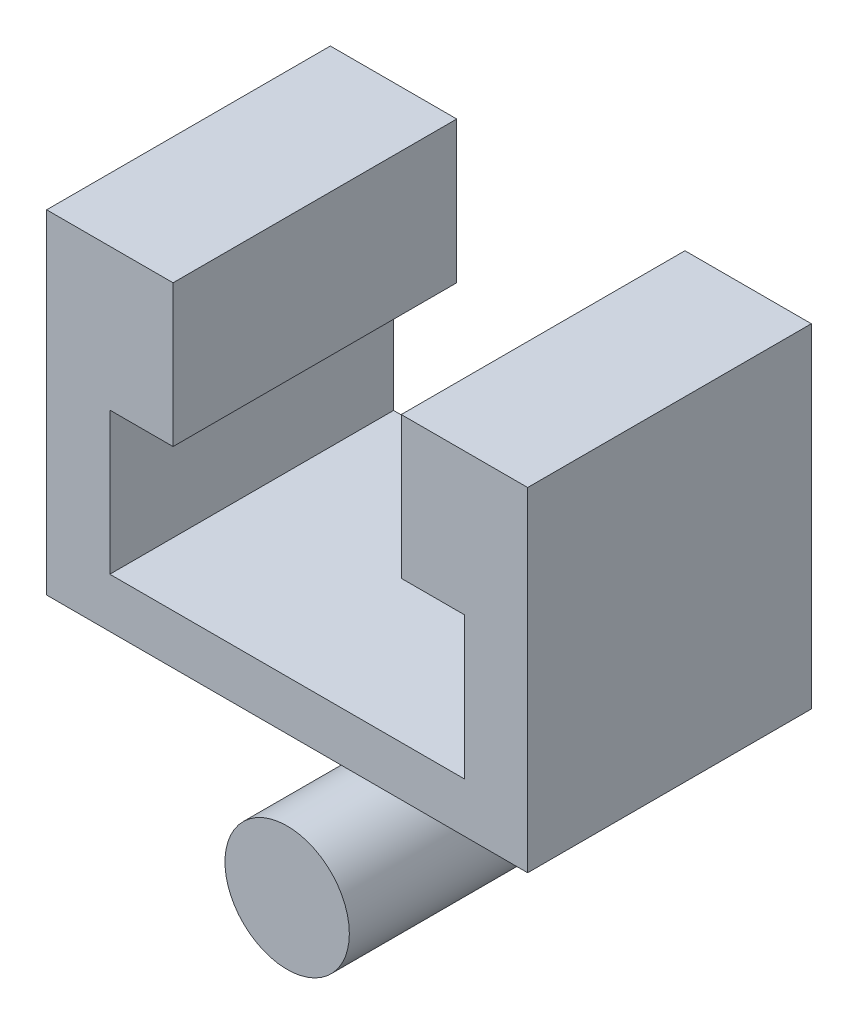
ISO-10303-21;
HEADER;
FILE_DESCRIPTION(('STEP AP214'),'2;1');
FILE_NAME('part.step','',(''),(''),'','','');
FILE_SCHEMA(('AUTOMOTIVE_DESIGN { 1 0 10303 214 1 1 1 1 }'));
ENDSEC;
DATA;
#1=APPLICATION_CONTEXT('core data for automotive mechanical design processes');
#2=APPLICATION_PROTOCOL_DEFINITION('international standard','automotive_design',2000,#1);
#3=PRODUCT_CONTEXT('',#1,'mechanical');
#4=PRODUCT('Part','Part','',(#3));
#5=PRODUCT_RELATED_PRODUCT_CATEGORY('part','',(#4));
#6=PRODUCT_DEFINITION_FORMATION('','',#4);
#7=PRODUCT_DEFINITION_CONTEXT('part definition',#1,'design');
#8=PRODUCT_DEFINITION('design','',#6,#7);
#9=PRODUCT_DEFINITION_SHAPE('','',#8);
#10=(LENGTH_UNIT() NAMED_UNIT(*) SI_UNIT(.MILLI.,.METRE.));
#11=(NAMED_UNIT(*) PLANE_ANGLE_UNIT() SI_UNIT($,.RADIAN.));
#12=(NAMED_UNIT(*) SI_UNIT($,.STERADIAN.) SOLID_ANGLE_UNIT());
#13=UNCERTAINTY_MEASURE_WITH_UNIT(LENGTH_MEASURE(1.E-05),#10,'distance_accuracy_value','');
#14=(GEOMETRIC_REPRESENTATION_CONTEXT(3) GLOBAL_UNCERTAINTY_ASSIGNED_CONTEXT((#13)) GLOBAL_UNIT_ASSIGNED_CONTEXT((#10,
#11,#12)) REPRESENTATION_CONTEXT('',''));
#15=CARTESIAN_POINT('',(0.,0.,0.));
#16=DIRECTION('',(0.,0.,1.));
#17=DIRECTION('',(1.,0.,0.));
#18=AXIS2_PLACEMENT_3D('',#15,#16,#17);
#19=CARTESIAN_POINT('',(0.,0.,0.));
#20=DIRECTION('',(0.,0.,1.));
#21=DIRECTION('',(1.,0.,0.));
#22=AXIS2_PLACEMENT_3D('',#19,#20,#21);
#23=PLANE('',#22);
#24=DIRECTION('',(0.,1.,0.));
#25=VECTOR('',#24,1.);
#26=CARTESIAN_POINT('',(-20.4314842766278,59.7480723545712,0.));
#27=LINE('',#26,#25);
#28=CARTESIAN_POINT('',(-20.4314842766278,59.7480723545712,0.));
#29=VERTEX_POINT('',#28);
#30=CARTESIAN_POINT('',(-20.4314842766277,85.1480723545712,0.));
#31=VERTEX_POINT('',#30);
#32=EDGE_CURVE('E217',#29,#31,#27,.T.);
#33=ORIENTED_EDGE('',*,*,#32,.F.);
#34=DIRECTION('',(1.,0.,0.));
#35=VECTOR('',#34,1.);
#36=CARTESIAN_POINT('',(-31.75,59.7480723545712,0.));
#37=LINE('',#36,#35);
#38=CARTESIAN_POINT('',(-31.75,59.7480723545712,0.));
#39=VERTEX_POINT('',#38);
#40=EDGE_CURVE('E230',#39,#29,#37,.T.);
#41=ORIENTED_EDGE('',*,*,#40,.F.);
#42=DIRECTION('',(0.,1.,0.));
#43=VECTOR('',#42,1.);
#44=CARTESIAN_POINT('',(-31.75,34.29,0.));
#45=LINE('',#44,#43);
#46=CARTESIAN_POINT('',(-31.75,34.29,0.));
#47=VERTEX_POINT('',#46);
#48=EDGE_CURVE('E228',#47,#39,#45,.T.);
#49=ORIENTED_EDGE('',*,*,#48,.F.);
#50=DIRECTION('',(-1.,0.,0.));
#51=VECTOR('',#50,1.);
#52=CARTESIAN_POINT('',(31.75,34.29,0.));
#53=LINE('',#52,#51);
#54=CARTESIAN_POINT('',(31.75,34.29,0.));
#55=VERTEX_POINT('',#54);
#56=EDGE_CURVE('E226',#55,#47,#53,.T.);
#57=ORIENTED_EDGE('',*,*,#56,.F.);
#58=DIRECTION('',(0.,-1.,0.));
#59=VECTOR('',#58,1.);
#60=CARTESIAN_POINT('',(31.75,59.7480723545712,0.));
#61=LINE('',#60,#59);
#62=CARTESIAN_POINT('',(31.75,59.7480723545712,0.));
#63=VERTEX_POINT('',#62);
#64=EDGE_CURVE('E224',#63,#55,#61,.T.);
#65=ORIENTED_EDGE('',*,*,#64,.F.);
#66=DIRECTION('',(1.,0.,0.));
#67=VECTOR('',#66,1.);
#68=CARTESIAN_POINT('',(20.4314842766277,59.7480723545712,0.));
#69=LINE('',#68,#67);
#70=CARTESIAN_POINT('',(20.4314842766277,59.7480723545712,0.));
#71=VERTEX_POINT('',#70);
#72=EDGE_CURVE('E222',#71,#63,#69,.T.);
#73=ORIENTED_EDGE('',*,*,#72,.F.);
#74=DIRECTION('',(0.,-1.,0.));
#75=VECTOR('',#74,1.);
#76=CARTESIAN_POINT('',(20.4314842766278,85.1480723545712,0.));
#77=LINE('',#76,#75);
#78=CARTESIAN_POINT('',(20.4314842766278,85.1480723545712,0.));
#79=VERTEX_POINT('',#78);
#80=EDGE_CURVE('E219',#79,#71,#77,.T.);
#81=ORIENTED_EDGE('',*,*,#80,.F.);
#82=DIRECTION('',(-1.,0.,0.));
#83=VECTOR('',#82,1.);
#84=CARTESIAN_POINT('',(43.0685157233723,85.1480723545712,0.));
#85=LINE('',#84,#83);
#86=CARTESIAN_POINT('',(43.0685157233723,85.1480723545712,0.));
#87=VERTEX_POINT('',#86);
#88=EDGE_CURVE('E274',#87,#79,#85,.T.);
#89=ORIENTED_EDGE('',*,*,#88,.F.);
#90=DIRECTION('',(0.,1.,0.));
#91=VECTOR('',#90,1.);
#92=CARTESIAN_POINT('',(43.0685157233722,25.4,0.));
#93=LINE('',#92,#91);
#94=CARTESIAN_POINT('',(43.0685157233722,25.4,0.));
#95=VERTEX_POINT('',#94);
#96=EDGE_CURVE('E289',#95,#87,#93,.T.);
#97=ORIENTED_EDGE('',*,*,#96,.F.);
#98=DIRECTION('',(1.,0.,0.));
#99=VECTOR('',#98,1.);
#100=CARTESIAN_POINT('',(-43.0685157233722,25.4,0.));
#101=LINE('',#100,#99);
#102=CARTESIAN_POINT('',(11.1361185564172,25.4,0.));
#103=VERTEX_POINT('',#102);
#104=EDGE_CURVE('E285',#103,#95,#101,.T.);
#105=ORIENTED_EDGE('',*,*,#104,.F.);
#106=DIRECTION('',(0.,-1.,0.));
#107=VECTOR('',#106,1.);
#108=CARTESIAN_POINT('',(11.1361185564172,25.4,0.));
#109=LINE('',#108,#107);
#110=CARTESIAN_POINT('',(11.1361185564172,0.,0.));
#111=VERTEX_POINT('',#110);
#112=EDGE_CURVE('E309',#103,#111,#109,.T.);
#113=ORIENTED_EDGE('',*,*,#112,.T.);
#114=CARTESIAN_POINT('',(0.,0.,0.));
#115=DIRECTION('',(0.,0.,1.));
#116=DIRECTION('',(1.,0.,0.));
#117=AXIS2_PLACEMENT_3D('',#114,#115,#116);
#118=CIRCLE('',#117,11.1361185564172);
#119=CARTESIAN_POINT('',(-11.1361185564172,0.,0.));
#120=VERTEX_POINT('',#119);
#121=EDGE_CURVE('E305',#120,#111,#118,.T.);
#122=ORIENTED_EDGE('',*,*,#121,.F.);
#123=DIRECTION('',(0.,1.,0.));
#124=VECTOR('',#123,1.);
#125=CARTESIAN_POINT('',(-11.1361185564172,0.,0.));
#126=LINE('',#125,#124);
#127=CARTESIAN_POINT('',(-11.1361185564172,25.4,0.));
#128=VERTEX_POINT('',#127);
#129=EDGE_CURVE('E315',#120,#128,#126,.T.);
#130=ORIENTED_EDGE('',*,*,#129,.T.);
#131=CARTESIAN_POINT('',(-43.0685157233722,25.4,0.));
#132=VERTEX_POINT('',#131);
#133=EDGE_CURVE('E286',#132,#128,#101,.T.);
#134=ORIENTED_EDGE('',*,*,#133,.F.);
#135=DIRECTION('',(0.,-1.,0.));
#136=VECTOR('',#135,1.);
#137=CARTESIAN_POINT('',(-43.0685157233723,85.1480723545712,0.));
#138=LINE('',#137,#136);
#139=CARTESIAN_POINT('',(-43.0685157233723,85.1480723545712,0.));
#140=VERTEX_POINT('',#139);
#141=EDGE_CURVE('E269',#140,#132,#138,.T.);
#142=ORIENTED_EDGE('',*,*,#141,.F.);
#143=EDGE_CURVE('E291',#31,#140,#85,.T.);
#144=ORIENTED_EDGE('',*,*,#143,.F.);
#145=EDGE_LOOP('',(#33,#41,#49,#57,#65,#73,#81,#89,#97,#105,#113,#122,#130,#134,#142,#144));
#146=FACE_BOUND('',#145,.T.);
#147=ADVANCED_FACE('F45',(#146),#23,.F.);
#148=CARTESIAN_POINT('',(43.0685157233723,85.1480723545712,50.8));
#149=DIRECTION('',(0.,-1.,0.));
#150=DIRECTION('',(0.,0.,-1.));
#151=AXIS2_PLACEMENT_3D('',#148,#149,#150);
#152=PLANE('',#151);
#153=DIRECTION('',(0.,0.,1.));
#154=VECTOR('',#153,1.);
#155=CARTESIAN_POINT('',(-20.4314842766277,85.1480723545712,0.));
#156=LINE('',#155,#154);
#157=CARTESIAN_POINT('',(-20.4314842766277,85.1480723545712,50.8));
#158=VERTEX_POINT('',#157);
#159=EDGE_CURVE('E267',#31,#158,#156,.T.);
#160=ORIENTED_EDGE('',*,*,#159,.F.);
#161=ORIENTED_EDGE('',*,*,#143,.T.);
#162=DIRECTION('',(0.,0.,-1.));
#163=VECTOR('',#162,1.);
#164=CARTESIAN_POINT('',(-43.0685157233723,85.1480723545712,50.8));
#165=LINE('',#164,#163);
#166=CARTESIAN_POINT('',(-43.0685157233723,85.1480723545712,50.8));
#167=VERTEX_POINT('',#166);
#168=EDGE_CURVE('E282',#167,#140,#165,.T.);
#169=ORIENTED_EDGE('',*,*,#168,.F.);
#170=DIRECTION('',(-1.,0.,0.));
#171=VECTOR('',#170,1.);
#172=CARTESIAN_POINT('',(43.0685157233723,85.1480723545712,50.8));
#173=LINE('',#172,#171);
#174=EDGE_CURVE('E278',#158,#167,#173,.T.);
#175=ORIENTED_EDGE('',*,*,#174,.F.);
#176=EDGE_LOOP('',(#160,#161,#169,#175));
#177=FACE_BOUND('',#176,.T.);
#178=ADVANCED_FACE('F377',(#177),#152,.F.);
#179=DIRECTION('',(0.,0.,1.));
#180=VECTOR('',#179,1.);
#181=CARTESIAN_POINT('',(20.4314842766278,85.1480723545712,0.));
#182=LINE('',#181,#180);
#183=CARTESIAN_POINT('',(20.4314842766278,85.1480723545712,50.8));
#184=VERTEX_POINT('',#183);
#185=EDGE_CURVE('E264',#79,#184,#182,.T.);
#186=ORIENTED_EDGE('',*,*,#185,.T.);
#187=CARTESIAN_POINT('',(43.0685157233723,85.1480723545712,50.8));
#188=VERTEX_POINT('',#187);
#189=EDGE_CURVE('E279',#188,#184,#173,.T.);
#190=ORIENTED_EDGE('',*,*,#189,.F.);
#191=DIRECTION('',(0.,0.,-1.));
#192=VECTOR('',#191,1.);
#193=CARTESIAN_POINT('',(43.0685157233723,85.1480723545712,50.8));
#194=LINE('',#193,#192);
#195=EDGE_CURVE('E296',#188,#87,#194,.T.);
#196=ORIENTED_EDGE('',*,*,#195,.T.);
#197=ORIENTED_EDGE('',*,*,#88,.T.);
#198=EDGE_LOOP('',(#186,#190,#196,#197));
#199=FACE_BOUND('',#198,.T.);
#200=ADVANCED_FACE('F383',(#199),#152,.F.);
#201=CARTESIAN_POINT('',(0.,0.,50.8));
#202=DIRECTION('',(0.,0.,1.));
#203=DIRECTION('',(1.,0.,0.));
#204=AXIS2_PLACEMENT_3D('',#201,#202,#203);
#205=PLANE('',#204);
#206=DIRECTION('',(1.,0.,0.));
#207=VECTOR('',#206,1.);
#208=CARTESIAN_POINT('',(-31.75,59.7480723545712,50.8));
#209=LINE('',#208,#207);
#210=CARTESIAN_POINT('',(-31.75,59.7480723545712,50.8));
#211=VERTEX_POINT('',#210);
#212=CARTESIAN_POINT('',(-20.4314842766278,59.7480723545712,50.8));
#213=VERTEX_POINT('',#212);
#214=EDGE_CURVE('E220',#211,#213,#209,.T.);
#215=ORIENTED_EDGE('',*,*,#214,.T.);
#216=DIRECTION('',(0.,1.,0.));
#217=VECTOR('',#216,1.);
#218=CARTESIAN_POINT('',(-20.4314842766278,59.7480723545712,50.8));
#219=LINE('',#218,#217);
#220=EDGE_CURVE('E214',#213,#158,#219,.T.);
#221=ORIENTED_EDGE('',*,*,#220,.T.);
#222=ORIENTED_EDGE('',*,*,#174,.T.);
#223=DIRECTION('',(0.,-1.,0.));
#224=VECTOR('',#223,1.);
#225=CARTESIAN_POINT('',(-43.0685157233723,85.1480723545712,50.8));
#226=LINE('',#225,#224);
#227=CARTESIAN_POINT('',(-43.0685157233722,25.4,50.8));
#228=VERTEX_POINT('',#227);
#229=EDGE_CURVE('E270',#167,#228,#226,.T.);
#230=ORIENTED_EDGE('',*,*,#229,.T.);
#231=DIRECTION('',(1.,0.,0.));
#232=VECTOR('',#231,1.);
#233=CARTESIAN_POINT('',(-43.0685157233722,25.4,50.8));
#234=LINE('',#233,#232);
#235=CARTESIAN_POINT('',(43.0685157233722,25.4,50.8));
#236=VERTEX_POINT('',#235);
#237=EDGE_CURVE('E273',#228,#236,#234,.T.);
#238=ORIENTED_EDGE('',*,*,#237,.T.);
#239=DIRECTION('',(0.,1.,0.));
#240=VECTOR('',#239,1.);
#241=CARTESIAN_POINT('',(43.0685157233722,25.4,50.8));
#242=LINE('',#241,#240);
#243=EDGE_CURVE('E276',#236,#188,#242,.T.);
#244=ORIENTED_EDGE('',*,*,#243,.T.);
#245=ORIENTED_EDGE('',*,*,#189,.T.);
#246=DIRECTION('',(0.,-1.,0.));
#247=VECTOR('',#246,1.);
#248=CARTESIAN_POINT('',(20.4314842766278,85.1480723545712,50.8));
#249=LINE('',#248,#247);
#250=CARTESIAN_POINT('',(20.4314842766277,59.7480723545712,50.8));
#251=VERTEX_POINT('',#250);
#252=EDGE_CURVE('E235',#184,#251,#249,.T.);
#253=ORIENTED_EDGE('',*,*,#252,.T.);
#254=DIRECTION('',(1.,0.,0.));
#255=VECTOR('',#254,1.);
#256=CARTESIAN_POINT('',(20.4314842766277,59.7480723545712,50.8));
#257=LINE('',#256,#255);
#258=CARTESIAN_POINT('',(31.75,59.7480723545712,50.8));
#259=VERTEX_POINT('',#258);
#260=EDGE_CURVE('E238',#251,#259,#257,.T.);
#261=ORIENTED_EDGE('',*,*,#260,.T.);
#262=DIRECTION('',(0.,-1.,0.));
#263=VECTOR('',#262,1.);
#264=CARTESIAN_POINT('',(31.75,59.7480723545712,50.8));
#265=LINE('',#264,#263);
#266=CARTESIAN_POINT('',(31.75,34.29,50.8));
#267=VERTEX_POINT('',#266);
#268=EDGE_CURVE('E241',#259,#267,#265,.T.);
#269=ORIENTED_EDGE('',*,*,#268,.T.);
#270=DIRECTION('',(-1.,0.,0.));
#271=VECTOR('',#270,1.);
#272=CARTESIAN_POINT('',(31.75,34.29,50.8));
#273=LINE('',#272,#271);
#274=CARTESIAN_POINT('',(-31.75,34.29,50.8));
#275=VERTEX_POINT('',#274);
#276=EDGE_CURVE('E244',#267,#275,#273,.T.);
#277=ORIENTED_EDGE('',*,*,#276,.T.);
#278=DIRECTION('',(0.,1.,0.));
#279=VECTOR('',#278,1.);
#280=CARTESIAN_POINT('',(-31.75,34.29,50.8));
#281=LINE('',#280,#279);
#282=EDGE_CURVE('E247',#275,#211,#281,.T.);
#283=ORIENTED_EDGE('',*,*,#282,.T.);
#284=EDGE_LOOP('',(#215,#221,#222,#230,#238,#244,#245,#253,#261,#269,#277,#283));
#285=FACE_BOUND('',#284,.T.);
#286=ADVANCED_FACE('F348',(#285),#205,.T.);
#287=CARTESIAN_POINT('',(11.1361185564172,25.4,2.52182673583121));
#288=DIRECTION('',(1.,0.,0.));
#289=DIRECTION('',(0.,1.,0.));
#290=AXIS2_PLACEMENT_3D('',#287,#288,#289);
#291=PLANE('',#290);
#292=ORIENTED_EDGE('',*,*,#112,.F.);
#293=DIRECTION('',(0.,0.,-1.));
#294=VECTOR('',#293,1.);
#295=CARTESIAN_POINT('',(11.1361185564172,25.4,2.52182673583121));
#296=LINE('',#295,#294);
#297=CARTESIAN_POINT('',(11.1361185564172,25.4,2.52182673583121));
#298=VERTEX_POINT('',#297);
#299=EDGE_CURVE('E11',#298,#103,#296,.T.);
#300=ORIENTED_EDGE('',*,*,#299,.F.);
#301=DIRECTION('',(0.,-1.,0.));
#302=VECTOR('',#301,1.);
#303=CARTESIAN_POINT('',(11.1361185564172,25.4,2.52182673583121));
#304=LINE('',#303,#302);
#305=CARTESIAN_POINT('',(11.1361185564172,0.,2.52182673583121));
#306=VERTEX_POINT('',#305);
#307=EDGE_CURVE('E311',#298,#306,#304,.T.);
#308=ORIENTED_EDGE('',*,*,#307,.T.);
#309=DIRECTION('',(0.,0.,-1.));
#310=VECTOR('',#309,1.);
#311=CARTESIAN_POINT('',(11.1361185564172,0.,2.52182673583121));
#312=LINE('',#311,#310);
#313=EDGE_CURVE('E49',#306,#111,#312,.T.);
#314=ORIENTED_EDGE('',*,*,#313,.T.);
#315=EDGE_LOOP('',(#292,#300,#308,#314));
#316=FACE_BOUND('',#315,.T.);
#317=ADVANCED_FACE('F47',(#316),#291,.T.);
#318=CARTESIAN_POINT('',(-11.1361185564172,0.,2.52182673583121));
#319=DIRECTION('',(-1.,0.,0.));
#320=DIRECTION('',(0.,-1.,0.));
#321=AXIS2_PLACEMENT_3D('',#318,#319,#320);
#322=PLANE('',#321);
#323=ORIENTED_EDGE('',*,*,#129,.F.);
#324=DIRECTION('',(0.,0.,-1.));
#325=VECTOR('',#324,1.);
#326=CARTESIAN_POINT('',(-11.1361185564172,0.,2.52182673583121));
#327=LINE('',#326,#325);
#328=CARTESIAN_POINT('',(-11.1361185564172,0.,2.52182673583121));
#329=VERTEX_POINT('',#328);
#330=EDGE_CURVE('E326',#329,#120,#327,.T.);
#331=ORIENTED_EDGE('',*,*,#330,.F.);
#332=DIRECTION('',(0.,1.,0.));
#333=VECTOR('',#332,1.);
#334=CARTESIAN_POINT('',(-11.1361185564172,0.,2.52182673583121));
#335=LINE('',#334,#333);
#336=CARTESIAN_POINT('',(-11.1361185564172,25.4,2.52182673583121));
#337=VERTEX_POINT('',#336);
#338=EDGE_CURVE('E317',#329,#337,#335,.T.);
#339=ORIENTED_EDGE('',*,*,#338,.T.);
#340=DIRECTION('',(0.,0.,-1.));
#341=VECTOR('',#340,1.);
#342=CARTESIAN_POINT('',(-11.1361185564172,25.4,2.52182673583121));
#343=LINE('',#342,#341);
#344=EDGE_CURVE('E54',#337,#128,#343,.T.);
#345=ORIENTED_EDGE('',*,*,#344,.T.);
#346=EDGE_LOOP('',(#323,#331,#339,#345));
#347=FACE_BOUND('',#346,.T.);
#348=ADVANCED_FACE('F357',(#347),#322,.T.);
#349=CARTESIAN_POINT('',(0.,0.,2.52182673583121));
#350=DIRECTION('',(0.,0.,1.));
#351=DIRECTION('',(1.,0.,0.));
#352=AXIS2_PLACEMENT_3D('',#349,#350,#351);
#353=PLANE('',#352);
#354=ORIENTED_EDGE('',*,*,#307,.F.);
#355=DIRECTION('',(1.,0.,0.));
#356=VECTOR('',#355,1.);
#357=CARTESIAN_POINT('',(-11.1361185564172,25.4,2.52182673583121));
#358=LINE('',#357,#356);
#359=EDGE_CURVE('E319',#337,#298,#358,.T.);
#360=ORIENTED_EDGE('',*,*,#359,.F.);
#361=ORIENTED_EDGE('',*,*,#338,.F.);
#362=CARTESIAN_POINT('',(0.,0.,2.52182673583121));
#363=DIRECTION('',(0.,0.,1.));
#364=DIRECTION('',(1.,0.,0.));
#365=AXIS2_PLACEMENT_3D('',#362,#363,#364);
#366=CIRCLE('',#365,11.1361185564172);
#367=EDGE_CURVE('E314',#306,#329,#366,.T.);
#368=ORIENTED_EDGE('',*,*,#367,.F.);
#369=EDGE_LOOP('',(#354,#360,#361,#368));
#370=FACE_BOUND('',#369,.T.);
#371=ADVANCED_FACE('F361',(#370),#353,.T.);
#372=CARTESIAN_POINT('',(0.,0.,50.8));
#373=DIRECTION('',(0.,0.,-1.));
#374=DIRECTION('',(-1.,0.,0.));
#375=AXIS2_PLACEMENT_3D('',#372,#373,#374);
#376=CYLINDRICAL_SURFACE('',#375,11.1361185564172);
#377=DIRECTION('',(0.,0.,1.));
#378=VECTOR('',#377,1.);
#379=CARTESIAN_POINT('',(-11.1361185564172,0.,22.8781732641688));
#380=LINE('',#379,#378);
#381=CARTESIAN_POINT('',(-11.1361185564172,0.,22.8781732641688));
#382=VERTEX_POINT('',#381);
#383=CARTESIAN_POINT('',(-11.1361185564172,0.,25.4));
#384=VERTEX_POINT('',#383);
#385=EDGE_CURVE('E67',#382,#384,#380,.T.);
#386=ORIENTED_EDGE('',*,*,#385,.F.);
#387=CARTESIAN_POINT('',(0.,0.,22.8781732641688));
#388=DIRECTION('',(0.,0.,1.));
#389=DIRECTION('',(1.,0.,0.));
#390=AXIS2_PLACEMENT_3D('',#387,#388,#389);
#391=CIRCLE('',#390,11.1361185564172);
#392=CARTESIAN_POINT('',(11.1361185564172,0.,22.8781732641688));
#393=VERTEX_POINT('',#392);
#394=EDGE_CURVE('E62',#393,#382,#391,.T.);
#395=ORIENTED_EDGE('',*,*,#394,.F.);
#396=DIRECTION('',(0.,0.,1.));
#397=VECTOR('',#396,1.);
#398=CARTESIAN_POINT('',(11.1361185564172,0.,22.8781732641688));
#399=LINE('',#398,#397);
#400=CARTESIAN_POINT('',(11.1361185564172,0.,25.4));
#401=VERTEX_POINT('',#400);
#402=EDGE_CURVE('E212',#393,#401,#399,.T.);
#403=ORIENTED_EDGE('',*,*,#402,.T.);
#404=CARTESIAN_POINT('',(0.,0.,25.4));
#405=DIRECTION('',(0.,0.,1.));
#406=DIRECTION('',(1.,0.,0.));
#407=AXIS2_PLACEMENT_3D('',#404,#405,#406);
#408=CIRCLE('',#407,11.1361185564172);
#409=EDGE_CURVE('E200',#401,#384,#408,.T.);
#410=ORIENTED_EDGE('',*,*,#409,.T.);
#411=EDGE_LOOP('',(#386,#395,#403,#410));
#412=FACE_BOUND('',#411,.T.);
#413=CARTESIAN_POINT('',(0.,0.,50.8));
#414=DIRECTION('',(0.,0.,1.));
#415=DIRECTION('',(1.,0.,0.));
#416=AXIS2_PLACEMENT_3D('',#413,#414,#415);
#417=CIRCLE('',#416,11.1361185564172);
#418=CARTESIAN_POINT('',(11.1361185564172,0.,50.8));
#419=VERTEX_POINT('',#418);
#420=EDGE_CURVE('E306',#419,#419,#417,.T.);
#421=ORIENTED_EDGE('',*,*,#420,.F.);
#422=EDGE_LOOP('',(#421));
#423=FACE_BOUND('',#422,.T.);
#424=ORIENTED_EDGE('',*,*,#121,.T.);
#425=ORIENTED_EDGE('',*,*,#313,.F.);
#426=ORIENTED_EDGE('',*,*,#367,.T.);
#427=ORIENTED_EDGE('',*,*,#330,.T.);
#428=EDGE_LOOP('',(#424,#425,#426,#427));
#429=FACE_BOUND('',#428,.T.);
#430=ADVANCED_FACE('F362',(#412,#423,#429),#376,.T.);
#431=CARTESIAN_POINT('',(0.,0.,50.8));
#432=DIRECTION('',(0.,0.,1.));
#433=DIRECTION('',(1.,0.,0.));
#434=AXIS2_PLACEMENT_3D('',#431,#432,#433);
#435=PLANE('',#434);
#436=ORIENTED_EDGE('',*,*,#420,.T.);
#437=EDGE_LOOP('',(#436));
#438=FACE_BOUND('',#437,.T.);
#439=ADVANCED_FACE('F364',(#438),#435,.T.);
#440=CARTESIAN_POINT('',(-43.0685157233723,85.1480723545712,50.8));
#441=DIRECTION('',(1.,0.,0.));
#442=DIRECTION('',(0.,1.,0.));
#443=AXIS2_PLACEMENT_3D('',#440,#441,#442);
#444=PLANE('',#443);
#445=ORIENTED_EDGE('',*,*,#141,.T.);
#446=DIRECTION('',(0.,0.,-1.));
#447=VECTOR('',#446,1.);
#448=CARTESIAN_POINT('',(-43.0685157233722,25.4,50.8));
#449=LINE('',#448,#447);
#450=EDGE_CURVE('E302',#228,#132,#449,.T.);
#451=ORIENTED_EDGE('',*,*,#450,.F.);
#452=ORIENTED_EDGE('',*,*,#229,.F.);
#453=ORIENTED_EDGE('',*,*,#168,.T.);
#454=EDGE_LOOP('',(#445,#451,#452,#453));
#455=FACE_BOUND('',#454,.T.);
#456=ADVANCED_FACE('F353',(#455),#444,.F.);
#457=CARTESIAN_POINT('',(-43.0685157233722,25.4,50.8));
#458=DIRECTION('',(0.,1.,0.));
#459=DIRECTION('',(0.,0.,1.));
#460=AXIS2_PLACEMENT_3D('',#457,#458,#459);
#461=PLANE('',#460);
#462=DIRECTION('',(0.,0.,1.));
#463=VECTOR('',#462,1.);
#464=CARTESIAN_POINT('',(11.1361185564172,25.4,22.8781732641688));
#465=LINE('',#464,#463);
#466=CARTESIAN_POINT('',(11.1361185564172,25.4,22.8781732641688));
#467=VERTEX_POINT('',#466);
#468=CARTESIAN_POINT('',(11.1361185564172,25.4,25.4));
#469=VERTEX_POINT('',#468);
#470=EDGE_CURVE('E193',#467,#469,#465,.T.);
#471=ORIENTED_EDGE('',*,*,#470,.F.);
#472=DIRECTION('',(1.,0.,0.));
#473=VECTOR('',#472,1.);
#474=CARTESIAN_POINT('',(-11.1361185564172,25.4,22.8781732641688));
#475=LINE('',#474,#473);
#476=CARTESIAN_POINT('',(-11.1361185564172,25.4,22.8781732641688));
#477=VERTEX_POINT('',#476);
#478=EDGE_CURVE('E189',#477,#467,#475,.T.);
#479=ORIENTED_EDGE('',*,*,#478,.F.);
#480=DIRECTION('',(0.,0.,1.));
#481=VECTOR('',#480,1.);
#482=CARTESIAN_POINT('',(-11.1361185564172,25.4,22.8781732641688));
#483=LINE('',#482,#481);
#484=CARTESIAN_POINT('',(-11.1361185564172,25.4,25.4));
#485=VERTEX_POINT('',#484);
#486=EDGE_CURVE('E181',#477,#485,#483,.T.);
#487=ORIENTED_EDGE('',*,*,#486,.T.);
#488=DIRECTION('',(1.,0.,0.));
#489=VECTOR('',#488,1.);
#490=CARTESIAN_POINT('',(-11.1361185564172,25.4,25.4));
#491=LINE('',#490,#489);
#492=EDGE_CURVE('E186',#485,#469,#491,.T.);
#493=ORIENTED_EDGE('',*,*,#492,.T.);
#494=EDGE_LOOP('',(#471,#479,#487,#493));
#495=FACE_BOUND('',#494,.T.);
#496=ORIENTED_EDGE('',*,*,#344,.F.);
#497=ORIENTED_EDGE('',*,*,#359,.T.);
#498=ORIENTED_EDGE('',*,*,#299,.T.);
#499=ORIENTED_EDGE('',*,*,#104,.T.);
#500=DIRECTION('',(0.,0.,-1.));
#501=VECTOR('',#500,1.);
#502=CARTESIAN_POINT('',(43.0685157233722,25.4,50.8));
#503=LINE('',#502,#501);
#504=EDGE_CURVE('E299',#236,#95,#503,.T.);
#505=ORIENTED_EDGE('',*,*,#504,.F.);
#506=ORIENTED_EDGE('',*,*,#237,.F.);
#507=ORIENTED_EDGE('',*,*,#450,.T.);
#508=ORIENTED_EDGE('',*,*,#133,.T.);
#509=EDGE_LOOP('',(#496,#497,#498,#499,#505,#506,#507,#508));
#510=FACE_BOUND('',#509,.T.);
#511=ADVANCED_FACE('F183',(#495,#510),#461,.F.);
#512=CARTESIAN_POINT('',(43.0685157233722,25.4,50.8));
#513=DIRECTION('',(-1.,0.,0.));
#514=DIRECTION('',(0.,-1.,0.));
#515=AXIS2_PLACEMENT_3D('',#512,#513,#514);
#516=PLANE('',#515);
#517=ORIENTED_EDGE('',*,*,#96,.T.);
#518=ORIENTED_EDGE('',*,*,#195,.F.);
#519=ORIENTED_EDGE('',*,*,#243,.F.);
#520=ORIENTED_EDGE('',*,*,#504,.T.);
#521=EDGE_LOOP('',(#517,#518,#519,#520));
#522=FACE_BOUND('',#521,.T.);
#523=ADVANCED_FACE('F344',(#522),#516,.F.);
#524=CARTESIAN_POINT('',(-20.4314842766278,59.7480723545712,0.));
#525=DIRECTION('',(1.,0.,0.));
#526=DIRECTION('',(0.,1.,0.));
#527=AXIS2_PLACEMENT_3D('',#524,#525,#526);
#528=PLANE('',#527);
#529=ORIENTED_EDGE('',*,*,#220,.F.);
#530=DIRECTION('',(0.,0.,1.));
#531=VECTOR('',#530,1.);
#532=CARTESIAN_POINT('',(-20.4314842766278,59.7480723545712,0.));
#533=LINE('',#532,#531);
#534=EDGE_CURVE('E232',#29,#213,#533,.T.);
#535=ORIENTED_EDGE('',*,*,#534,.F.);
#536=ORIENTED_EDGE('',*,*,#32,.T.);
#537=ORIENTED_EDGE('',*,*,#159,.T.);
#538=EDGE_LOOP('',(#529,#535,#536,#537));
#539=FACE_BOUND('',#538,.T.);
#540=ADVANCED_FACE('F400',(#539),#528,.T.);
#541=CARTESIAN_POINT('',(20.4314842766278,85.1480723545712,0.));
#542=DIRECTION('',(-1.,0.,0.));
#543=DIRECTION('',(0.,-1.,0.));
#544=AXIS2_PLACEMENT_3D('',#541,#542,#543);
#545=PLANE('',#544);
#546=ORIENTED_EDGE('',*,*,#252,.F.);
#547=ORIENTED_EDGE('',*,*,#185,.F.);
#548=ORIENTED_EDGE('',*,*,#80,.T.);
#549=DIRECTION('',(0.,0.,1.));
#550=VECTOR('',#549,1.);
#551=CARTESIAN_POINT('',(20.4314842766277,59.7480723545712,0.));
#552=LINE('',#551,#550);
#553=EDGE_CURVE('E262',#71,#251,#552,.T.);
#554=ORIENTED_EDGE('',*,*,#553,.T.);
#555=EDGE_LOOP('',(#546,#547,#548,#554));
#556=FACE_BOUND('',#555,.T.);
#557=ADVANCED_FACE('F453',(#556),#545,.T.);
#558=CARTESIAN_POINT('',(20.4314842766277,59.7480723545712,0.));
#559=DIRECTION('',(0.,-1.,0.));
#560=DIRECTION('',(0.,0.,-1.));
#561=AXIS2_PLACEMENT_3D('',#558,#559,#560);
#562=PLANE('',#561);
#563=ORIENTED_EDGE('',*,*,#260,.F.);
#564=ORIENTED_EDGE('',*,*,#553,.F.);
#565=ORIENTED_EDGE('',*,*,#72,.T.);
#566=DIRECTION('',(0.,0.,1.));
#567=VECTOR('',#566,1.);
#568=CARTESIAN_POINT('',(31.75,59.7480723545712,0.));
#569=LINE('',#568,#567);
#570=EDGE_CURVE('E260',#63,#259,#569,.T.);
#571=ORIENTED_EDGE('',*,*,#570,.T.);
#572=EDGE_LOOP('',(#563,#564,#565,#571));
#573=FACE_BOUND('',#572,.T.);
#574=ADVANCED_FACE('F462',(#573),#562,.T.);
#575=CARTESIAN_POINT('',(31.75,59.7480723545712,0.));
#576=DIRECTION('',(-1.,0.,0.));
#577=DIRECTION('',(0.,-1.,0.));
#578=AXIS2_PLACEMENT_3D('',#575,#576,#577);
#579=PLANE('',#578);
#580=ORIENTED_EDGE('',*,*,#268,.F.);
#581=ORIENTED_EDGE('',*,*,#570,.F.);
#582=ORIENTED_EDGE('',*,*,#64,.T.);
#583=DIRECTION('',(0.,0.,1.));
#584=VECTOR('',#583,1.);
#585=CARTESIAN_POINT('',(31.75,34.29,0.));
#586=LINE('',#585,#584);
#587=EDGE_CURVE('E258',#55,#267,#586,.T.);
#588=ORIENTED_EDGE('',*,*,#587,.T.);
#589=EDGE_LOOP('',(#580,#581,#582,#588));
#590=FACE_BOUND('',#589,.T.);
#591=ADVANCED_FACE('F471',(#590),#579,.T.);
#592=CARTESIAN_POINT('',(31.75,34.29,0.));
#593=DIRECTION('',(0.,1.,0.));
#594=DIRECTION('',(-1.,0.,0.));
#595=AXIS2_PLACEMENT_3D('',#592,#593,#594);
#596=PLANE('',#595);
#597=ORIENTED_EDGE('',*,*,#276,.F.);
#598=ORIENTED_EDGE('',*,*,#587,.F.);
#599=ORIENTED_EDGE('',*,*,#56,.T.);
#600=DIRECTION('',(0.,0.,1.));
#601=VECTOR('',#600,1.);
#602=CARTESIAN_POINT('',(-31.75,34.29,0.));
#603=LINE('',#602,#601);
#604=EDGE_CURVE('E256',#47,#275,#603,.T.);
#605=ORIENTED_EDGE('',*,*,#604,.T.);
#606=EDGE_LOOP('',(#597,#598,#599,#605));
#607=FACE_BOUND('',#606,.T.);
#608=ADVANCED_FACE('F481',(#607),#596,.T.);
#609=CARTESIAN_POINT('',(-31.75,34.29,0.));
#610=DIRECTION('',(1.,0.,0.));
#611=DIRECTION('',(0.,0.,-1.));
#612=AXIS2_PLACEMENT_3D('',#609,#610,#611);
#613=PLANE('',#612);
#614=ORIENTED_EDGE('',*,*,#282,.F.);
#615=ORIENTED_EDGE('',*,*,#604,.F.);
#616=ORIENTED_EDGE('',*,*,#48,.T.);
#617=DIRECTION('',(0.,0.,1.));
#618=VECTOR('',#617,1.);
#619=CARTESIAN_POINT('',(-31.75,59.7480723545712,0.));
#620=LINE('',#619,#618);
#621=EDGE_CURVE('E254',#39,#211,#620,.T.);
#622=ORIENTED_EDGE('',*,*,#621,.T.);
#623=EDGE_LOOP('',(#614,#615,#616,#622));
#624=FACE_BOUND('',#623,.T.);
#625=ADVANCED_FACE('F491',(#624),#613,.T.);
#626=CARTESIAN_POINT('',(-31.75,59.7480723545712,0.));
#627=DIRECTION('',(0.,-1.,0.));
#628=DIRECTION('',(0.,0.,-1.));
#629=AXIS2_PLACEMENT_3D('',#626,#627,#628);
#630=PLANE('',#629);
#631=ORIENTED_EDGE('',*,*,#214,.F.);
#632=ORIENTED_EDGE('',*,*,#621,.F.);
#633=ORIENTED_EDGE('',*,*,#40,.T.);
#634=ORIENTED_EDGE('',*,*,#534,.T.);
#635=EDGE_LOOP('',(#631,#632,#633,#634));
#636=FACE_BOUND('',#635,.T.);
#637=ADVANCED_FACE('F501',(#636),#630,.T.);
#638=CARTESIAN_POINT('',(11.1361185564172,25.4,22.8781732641688));
#639=DIRECTION('',(-1.,0.,0.));
#640=DIRECTION('',(0.,-1.,0.));
#641=AXIS2_PLACEMENT_3D('',#638,#639,#640);
#642=PLANE('',#641);
#643=DIRECTION('',(0.,-1.,0.));
#644=VECTOR('',#643,1.);
#645=CARTESIAN_POINT('',(11.1361185564172,25.4,25.4));
#646=LINE('',#645,#644);
#647=EDGE_CURVE('E205',#469,#401,#646,.T.);
#648=ORIENTED_EDGE('',*,*,#647,.T.);
#649=ORIENTED_EDGE('',*,*,#402,.F.);
#650=DIRECTION('',(0.,-1.,0.));
#651=VECTOR('',#650,1.);
#652=CARTESIAN_POINT('',(11.1361185564172,25.4,22.8781732641688));
#653=LINE('',#652,#651);
#654=EDGE_CURVE('E211',#467,#393,#653,.T.);
#655=ORIENTED_EDGE('',*,*,#654,.F.);
#656=ORIENTED_EDGE('',*,*,#470,.T.);
#657=EDGE_LOOP('',(#648,#649,#655,#656));
#658=FACE_BOUND('',#657,.T.);
#659=ADVANCED_FACE('F510',(#658),#642,.F.);
#660=CARTESIAN_POINT('',(-11.1361185564172,0.,22.8781732641688));
#661=DIRECTION('',(1.,0.,0.));
#662=DIRECTION('',(0.,1.,0.));
#663=AXIS2_PLACEMENT_3D('',#660,#661,#662);
#664=PLANE('',#663);
#665=DIRECTION('',(0.,1.,0.));
#666=VECTOR('',#665,1.);
#667=CARTESIAN_POINT('',(-11.1361185564172,0.,25.4));
#668=LINE('',#667,#666);
#669=EDGE_CURVE('E196',#384,#485,#668,.T.);
#670=ORIENTED_EDGE('',*,*,#669,.T.);
#671=ORIENTED_EDGE('',*,*,#486,.F.);
#672=DIRECTION('',(0.,1.,0.));
#673=VECTOR('',#672,1.);
#674=CARTESIAN_POINT('',(-11.1361185564172,0.,22.8781732641688));
#675=LINE('',#674,#673);
#676=EDGE_CURVE('E577',#382,#477,#675,.T.);
#677=ORIENTED_EDGE('',*,*,#676,.F.);
#678=ORIENTED_EDGE('',*,*,#385,.T.);
#679=EDGE_LOOP('',(#670,#671,#677,#678));
#680=FACE_BOUND('',#679,.T.);
#681=ADVANCED_FACE('F197',(#680),#664,.F.);
#682=CARTESIAN_POINT('',(0.,0.,22.8781732641688));
#683=DIRECTION('',(0.,0.,-1.));
#684=DIRECTION('',(1.,0.,0.));
#685=AXIS2_PLACEMENT_3D('',#682,#683,#684);
#686=PLANE('',#685);
#687=ORIENTED_EDGE('',*,*,#654,.T.);
#688=ORIENTED_EDGE('',*,*,#394,.T.);
#689=ORIENTED_EDGE('',*,*,#676,.T.);
#690=ORIENTED_EDGE('',*,*,#478,.T.);
#691=EDGE_LOOP('',(#687,#688,#689,#690));
#692=FACE_BOUND('',#691,.T.);
#693=ADVANCED_FACE('F531',(#692),#686,.T.);
#694=CARTESIAN_POINT('',(0.,0.,25.4));
#695=DIRECTION('',(0.,0.,-1.));
#696=DIRECTION('',(1.,0.,0.));
#697=AXIS2_PLACEMENT_3D('',#694,#695,#696);
#698=PLANE('',#697);
#699=ORIENTED_EDGE('',*,*,#647,.F.);
#700=ORIENTED_EDGE('',*,*,#492,.F.);
#701=ORIENTED_EDGE('',*,*,#669,.F.);
#702=ORIENTED_EDGE('',*,*,#409,.F.);
#703=EDGE_LOOP('',(#699,#700,#701,#702));
#704=FACE_BOUND('',#703,.T.);
#705=ADVANCED_FACE('F203',(#704),#698,.F.);
#706=CLOSED_SHELL('',(#147,#178,#200,#286,#317,#348,#371,#430,#439,#456,#511,#523,#540,#557,
#574,#591,#608,#625,#637,#659,#681,#693,#705));
#707=MANIFOLD_SOLID_BREP('B2',#706);
#708=ADVANCED_BREP_SHAPE_REPRESENTATION('',(#18,#707),#14);
#709=SHAPE_DEFINITION_REPRESENTATION(#9,#708);
ENDSEC;
END-ISO-10303-21;
